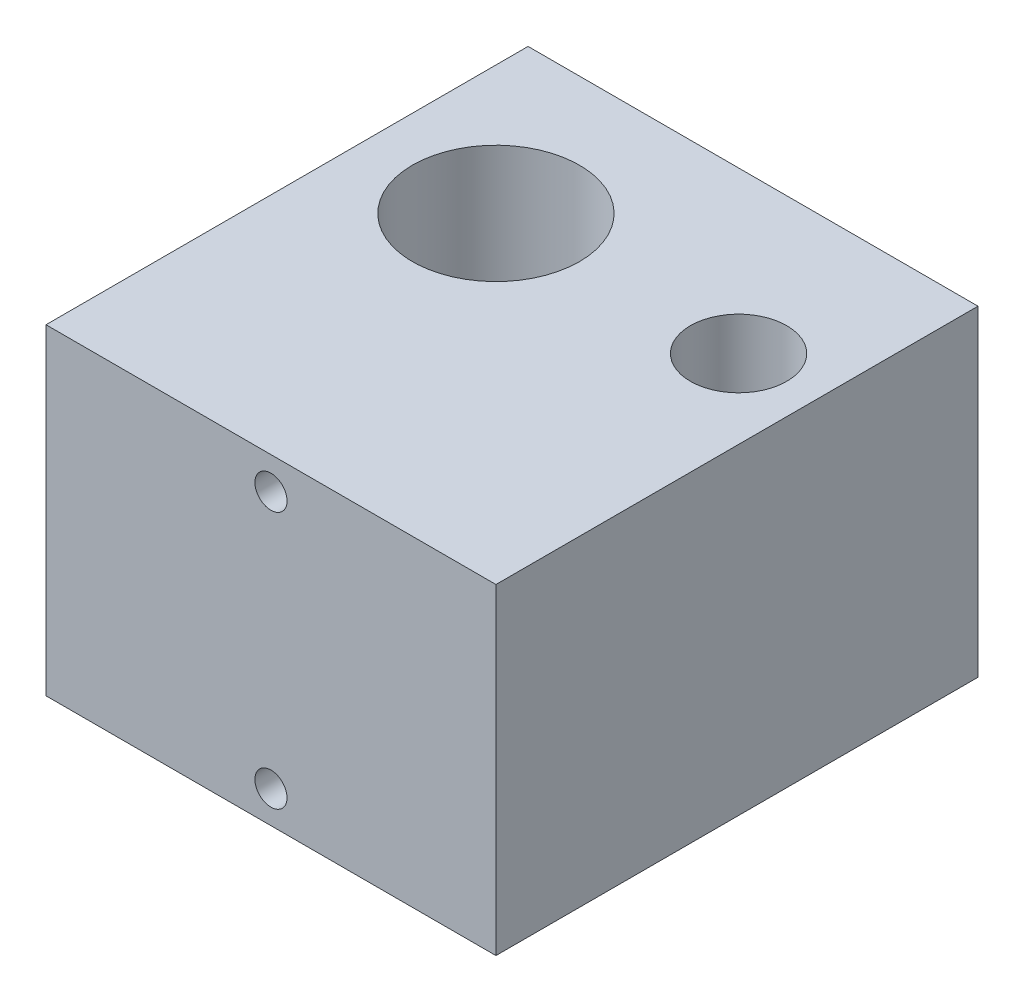
ISO-10303-21;
HEADER;
FILE_DESCRIPTION(('STEP AP214'),'2;1');
FILE_NAME('part.step','',(''),(''),'','','');
FILE_SCHEMA(('AUTOMOTIVE_DESIGN { 1 0 10303 214 1 1 1 1 }'));
ENDSEC;
DATA;
#1=APPLICATION_CONTEXT('core data for automotive mechanical design processes');
#2=APPLICATION_PROTOCOL_DEFINITION('international standard','automotive_design',2000,#1);
#3=PRODUCT_CONTEXT('',#1,'mechanical');
#4=PRODUCT('Part','Part','',(#3));
#5=PRODUCT_RELATED_PRODUCT_CATEGORY('part','',(#4));
#6=PRODUCT_DEFINITION_FORMATION('','',#4);
#7=PRODUCT_DEFINITION_CONTEXT('part definition',#1,'design');
#8=PRODUCT_DEFINITION('design','',#6,#7);
#9=PRODUCT_DEFINITION_SHAPE('','',#8);
#10=(LENGTH_UNIT() NAMED_UNIT(*) SI_UNIT(.MILLI.,.METRE.));
#11=(NAMED_UNIT(*) PLANE_ANGLE_UNIT() SI_UNIT($,.RADIAN.));
#12=(NAMED_UNIT(*) SI_UNIT($,.STERADIAN.) SOLID_ANGLE_UNIT());
#13=UNCERTAINTY_MEASURE_WITH_UNIT(LENGTH_MEASURE(1.E-05),#10,'distance_accuracy_value','');
#14=(GEOMETRIC_REPRESENTATION_CONTEXT(3) GLOBAL_UNCERTAINTY_ASSIGNED_CONTEXT((#13)) GLOBAL_UNIT_ASSIGNED_CONTEXT((#10,
#11,#12)) REPRESENTATION_CONTEXT('',''));
#15=CARTESIAN_POINT('',(0.,0.,0.));
#16=DIRECTION('',(0.,0.,1.));
#17=DIRECTION('',(1.,0.,0.));
#18=AXIS2_PLACEMENT_3D('',#15,#16,#17);
#19=CARTESIAN_POINT('',(-35.,-25.,75.));
#20=DIRECTION('',(1.,0.,0.));
#21=DIRECTION('',(0.,0.,-1.));
#22=AXIS2_PLACEMENT_3D('',#19,#20,#21);
#23=PLANE('',#22);
#24=DIRECTION('',(0.,-1.,0.));
#25=VECTOR('',#24,1.);
#26=CARTESIAN_POINT('',(-35.,-25.,0.));
#27=LINE('',#26,#25);
#28=CARTESIAN_POINT('',(-35.,25.,0.));
#29=VERTEX_POINT('',#28);
#30=CARTESIAN_POINT('',(-35.,-25.,0.));
#31=VERTEX_POINT('',#30);
#32=EDGE_CURVE('E107',#29,#31,#27,.T.);
#33=ORIENTED_EDGE('',*,*,#32,.T.);
#34=DIRECTION('',(0.,0.,-1.));
#35=VECTOR('',#34,1.);
#36=CARTESIAN_POINT('',(-35.,-25.,75.));
#37=LINE('',#36,#35);
#38=CARTESIAN_POINT('',(-35.,-25.,75.));
#39=VERTEX_POINT('',#38);
#40=EDGE_CURVE('E11',#39,#31,#37,.T.);
#41=ORIENTED_EDGE('',*,*,#40,.F.);
#42=DIRECTION('',(0.,-1.,0.));
#43=VECTOR('',#42,1.);
#44=CARTESIAN_POINT('',(-35.,-25.,75.));
#45=LINE('',#44,#43);
#46=CARTESIAN_POINT('',(-35.,25.,75.));
#47=VERTEX_POINT('',#46);
#48=EDGE_CURVE('E91',#47,#39,#45,.T.);
#49=ORIENTED_EDGE('',*,*,#48,.F.);
#50=DIRECTION('',(0.,0.,-1.));
#51=VECTOR('',#50,1.);
#52=CARTESIAN_POINT('',(-35.,25.,75.));
#53=LINE('',#52,#51);
#54=EDGE_CURVE('E103',#47,#29,#53,.T.);
#55=ORIENTED_EDGE('',*,*,#54,.T.);
#56=EDGE_LOOP('',(#33,#41,#49,#55));
#57=FACE_BOUND('',#56,.T.);
#58=ADVANCED_FACE('F39',(#57),#23,.F.);
#59=CARTESIAN_POINT('',(35.,-25.,75.));
#60=DIRECTION('',(0.,1.,0.));
#61=DIRECTION('',(-1.,0.,0.));
#62=AXIS2_PLACEMENT_3D('',#59,#60,#61);
#63=PLANE('',#62);
#64=CARTESIAN_POINT('',(22.75,-25.,25.));
#65=DIRECTION('',(0.,1.,0.));
#66=DIRECTION('',(-1.,0.,0.));
#67=AXIS2_PLACEMENT_3D('',#64,#65,#66);
#68=CIRCLE('',#67,7.5);
#69=CARTESIAN_POINT('',(15.25,-25.,25.));
#70=VERTEX_POINT('',#69);
#71=EDGE_CURVE('E111',#70,#70,#68,.F.);
#72=ORIENTED_EDGE('',*,*,#71,.F.);
#73=EDGE_LOOP('',(#72));
#74=FACE_BOUND('',#73,.T.);
#75=CARTESIAN_POINT('',(-15.,-25.,25.));
#76=DIRECTION('',(0.,1.,0.));
#77=DIRECTION('',(-1.,0.,0.));
#78=AXIS2_PLACEMENT_3D('',#75,#76,#77);
#79=CIRCLE('',#78,13.);
#80=CARTESIAN_POINT('',(-28.,-25.,25.));
#81=VERTEX_POINT('',#80);
#82=EDGE_CURVE('E128',#81,#81,#79,.F.);
#83=ORIENTED_EDGE('',*,*,#82,.F.);
#84=EDGE_LOOP('',(#83));
#85=FACE_BOUND('',#84,.T.);
#86=DIRECTION('',(1.,0.,0.));
#87=VECTOR('',#86,1.);
#88=CARTESIAN_POINT('',(35.,-25.,0.));
#89=LINE('',#88,#87);
#90=CARTESIAN_POINT('',(35.,-25.,0.));
#91=VERTEX_POINT('',#90);
#92=EDGE_CURVE('E96',#31,#91,#89,.T.);
#93=ORIENTED_EDGE('',*,*,#92,.T.);
#94=DIRECTION('',(0.,0.,-1.));
#95=VECTOR('',#94,1.);
#96=CARTESIAN_POINT('',(35.,-25.,75.));
#97=LINE('',#96,#95);
#98=CARTESIAN_POINT('',(35.,-25.,75.));
#99=VERTEX_POINT('',#98);
#100=EDGE_CURVE('E48',#99,#91,#97,.T.);
#101=ORIENTED_EDGE('',*,*,#100,.F.);
#102=DIRECTION('',(1.,0.,0.));
#103=VECTOR('',#102,1.);
#104=CARTESIAN_POINT('',(35.,-25.,75.));
#105=LINE('',#104,#103);
#106=EDGE_CURVE('E86',#39,#99,#105,.T.);
#107=ORIENTED_EDGE('',*,*,#106,.F.);
#108=ORIENTED_EDGE('',*,*,#40,.T.);
#109=EDGE_LOOP('',(#93,#101,#107,#108));
#110=FACE_BOUND('',#109,.T.);
#111=ADVANCED_FACE('F95',(#74,#85,#110),#63,.F.);
#112=CARTESIAN_POINT('',(35.,-25.,75.));
#113=DIRECTION('',(-1.,0.,0.));
#114=DIRECTION('',(0.,0.,1.));
#115=AXIS2_PLACEMENT_3D('',#112,#113,#114);
#116=PLANE('',#115);
#117=DIRECTION('',(0.,1.,0.));
#118=VECTOR('',#117,1.);
#119=CARTESIAN_POINT('',(35.,-25.,0.));
#120=LINE('',#119,#118);
#121=CARTESIAN_POINT('',(35.,25.,0.));
#122=VERTEX_POINT('',#121);
#123=EDGE_CURVE('E73',#91,#122,#120,.T.);
#124=ORIENTED_EDGE('',*,*,#123,.T.);
#125=DIRECTION('',(0.,0.,-1.));
#126=VECTOR('',#125,1.);
#127=CARTESIAN_POINT('',(35.,25.,75.));
#128=LINE('',#127,#126);
#129=CARTESIAN_POINT('',(35.,25.,75.));
#130=VERTEX_POINT('',#129);
#131=EDGE_CURVE('E98',#130,#122,#128,.T.);
#132=ORIENTED_EDGE('',*,*,#131,.F.);
#133=DIRECTION('',(0.,1.,0.));
#134=VECTOR('',#133,1.);
#135=CARTESIAN_POINT('',(35.,-25.,75.));
#136=LINE('',#135,#134);
#137=EDGE_CURVE('E89',#99,#130,#136,.T.);
#138=ORIENTED_EDGE('',*,*,#137,.F.);
#139=ORIENTED_EDGE('',*,*,#100,.T.);
#140=EDGE_LOOP('',(#124,#132,#138,#139));
#141=FACE_BOUND('',#140,.T.);
#142=ADVANCED_FACE('F99',(#141),#116,.F.);
#143=CARTESIAN_POINT('',(35.,25.,75.));
#144=DIRECTION('',(0.,-1.,0.));
#145=DIRECTION('',(1.,0.,0.));
#146=AXIS2_PLACEMENT_3D('',#143,#144,#145);
#147=PLANE('',#146);
#148=CARTESIAN_POINT('',(22.75,25.,25.));
#149=DIRECTION('',(0.,1.,0.));
#150=DIRECTION('',(-1.,0.,0.));
#151=AXIS2_PLACEMENT_3D('',#148,#149,#150);
#152=CIRCLE('',#151,7.5);
#153=CARTESIAN_POINT('',(15.25,25.,25.));
#154=VERTEX_POINT('',#153);
#155=EDGE_CURVE('E132',#154,#154,#152,.T.);
#156=ORIENTED_EDGE('',*,*,#155,.F.);
#157=EDGE_LOOP('',(#156));
#158=FACE_BOUND('',#157,.T.);
#159=CARTESIAN_POINT('',(-15.,25.,25.));
#160=DIRECTION('',(0.,1.,0.));
#161=DIRECTION('',(-1.,0.,0.));
#162=AXIS2_PLACEMENT_3D('',#159,#160,#161);
#163=CIRCLE('',#162,13.);
#164=CARTESIAN_POINT('',(-28.,25.,25.));
#165=VERTEX_POINT('',#164);
#166=EDGE_CURVE('E133',#165,#165,#163,.T.);
#167=ORIENTED_EDGE('',*,*,#166,.F.);
#168=EDGE_LOOP('',(#167));
#169=FACE_BOUND('',#168,.T.);
#170=DIRECTION('',(-1.,0.,0.));
#171=VECTOR('',#170,1.);
#172=CARTESIAN_POINT('',(35.,25.,0.));
#173=LINE('',#172,#171);
#174=EDGE_CURVE('E79',#122,#29,#173,.T.);
#175=ORIENTED_EDGE('',*,*,#174,.T.);
#176=ORIENTED_EDGE('',*,*,#54,.F.);
#177=DIRECTION('',(-1.,0.,0.));
#178=VECTOR('',#177,1.);
#179=CARTESIAN_POINT('',(35.,25.,75.));
#180=LINE('',#179,#178);
#181=EDGE_CURVE('E56',#130,#47,#180,.T.);
#182=ORIENTED_EDGE('',*,*,#181,.F.);
#183=ORIENTED_EDGE('',*,*,#131,.T.);
#184=EDGE_LOOP('',(#175,#176,#182,#183));
#185=FACE_BOUND('',#184,.T.);
#186=ADVANCED_FACE('F121',(#158,#169,#185),#147,.F.);
#187=CARTESIAN_POINT('',(0.,0.,75.));
#188=DIRECTION('',(0.,0.,1.));
#189=DIRECTION('',(1.,0.,0.));
#190=AXIS2_PLACEMENT_3D('',#187,#188,#189);
#191=PLANE('',#190);
#192=CARTESIAN_POINT('',(0.,-20.,75.));
#193=DIRECTION('',(0.,0.,1.));
#194=DIRECTION('',(1.,0.,0.));
#195=AXIS2_PLACEMENT_3D('',#192,#193,#194);
#196=CIRCLE('',#195,2.5);
#197=CARTESIAN_POINT('',(2.50000000000001,-20.,75.));
#198=VERTEX_POINT('',#197);
#199=EDGE_CURVE('E152',#198,#198,#196,.T.);
#200=ORIENTED_EDGE('',*,*,#199,.F.);
#201=EDGE_LOOP('',(#200));
#202=FACE_BOUND('',#201,.T.);
#203=CARTESIAN_POINT('',(0.,20.,75.));
#204=DIRECTION('',(0.,0.,1.));
#205=DIRECTION('',(-1.,0.,0.));
#206=AXIS2_PLACEMENT_3D('',#203,#204,#205);
#207=CIRCLE('',#206,2.5);
#208=CARTESIAN_POINT('',(-2.49999999999999,20.,75.));
#209=VERTEX_POINT('',#208);
#210=EDGE_CURVE('E144',#209,#209,#207,.T.);
#211=ORIENTED_EDGE('',*,*,#210,.F.);
#212=EDGE_LOOP('',(#211));
#213=FACE_BOUND('',#212,.T.);
#214=ORIENTED_EDGE('',*,*,#48,.T.);
#215=ORIENTED_EDGE('',*,*,#106,.T.);
#216=ORIENTED_EDGE('',*,*,#137,.T.);
#217=ORIENTED_EDGE('',*,*,#181,.T.);
#218=EDGE_LOOP('',(#214,#215,#216,#217));
#219=FACE_BOUND('',#218,.T.);
#220=ADVANCED_FACE('F87',(#202,#213,#219),#191,.T.);
#221=CARTESIAN_POINT('',(0.,0.,0.));
#222=DIRECTION('',(0.,0.,1.));
#223=DIRECTION('',(1.,0.,0.));
#224=AXIS2_PLACEMENT_3D('',#221,#222,#223);
#225=PLANE('',#224);
#226=ORIENTED_EDGE('',*,*,#32,.F.);
#227=ORIENTED_EDGE('',*,*,#174,.F.);
#228=ORIENTED_EDGE('',*,*,#123,.F.);
#229=ORIENTED_EDGE('',*,*,#92,.F.);
#230=EDGE_LOOP('',(#226,#227,#228,#229));
#231=FACE_BOUND('',#230,.T.);
#232=ADVANCED_FACE('F124',(#231),#225,.F.);
#233=CARTESIAN_POINT('',(-15.,-25.001,25.));
#234=DIRECTION('',(0.,1.,0.));
#235=DIRECTION('',(-1.,0.,0.));
#236=AXIS2_PLACEMENT_3D('',#233,#234,#235);
#237=CYLINDRICAL_SURFACE('',#236,13.);
#238=ORIENTED_EDGE('',*,*,#166,.T.);
#239=EDGE_LOOP('',(#238));
#240=FACE_BOUND('',#239,.T.);
#241=ORIENTED_EDGE('',*,*,#82,.T.);
#242=EDGE_LOOP('',(#241));
#243=FACE_BOUND('',#242,.T.);
#244=ADVANCED_FACE('F185',(#240,#243),#237,.F.);
#245=CARTESIAN_POINT('',(22.75,-25.001,25.));
#246=DIRECTION('',(0.,1.,0.));
#247=DIRECTION('',(-1.,0.,0.));
#248=AXIS2_PLACEMENT_3D('',#245,#246,#247);
#249=CYLINDRICAL_SURFACE('',#248,7.5);
#250=ORIENTED_EDGE('',*,*,#155,.T.);
#251=EDGE_LOOP('',(#250));
#252=FACE_BOUND('',#251,.T.);
#253=ORIENTED_EDGE('',*,*,#71,.T.);
#254=EDGE_LOOP('',(#253));
#255=FACE_BOUND('',#254,.T.);
#256=ADVANCED_FACE('F176',(#252,#255),#249,.F.);
#257=CARTESIAN_POINT('',(0.,20.,55.));
#258=DIRECTION('',(0.,0.,1.));
#259=DIRECTION('',(1.,0.,0.));
#260=AXIS2_PLACEMENT_3D('',#257,#258,#259);
#261=CYLINDRICAL_SURFACE('',#260,2.5);
#262=CARTESIAN_POINT('',(0.,20.,55.));
#263=DIRECTION('',(0.,0.,1.));
#264=DIRECTION('',(-1.,0.,0.));
#265=AXIS2_PLACEMENT_3D('',#262,#263,#264);
#266=CIRCLE('',#265,2.5);
#267=CARTESIAN_POINT('',(-2.49999999999999,20.,55.));
#268=VERTEX_POINT('',#267);
#269=EDGE_CURVE('E148',#268,#268,#266,.T.);
#270=ORIENTED_EDGE('',*,*,#269,.F.);
#271=EDGE_LOOP('',(#270));
#272=FACE_BOUND('',#271,.T.);
#273=ORIENTED_EDGE('',*,*,#210,.T.);
#274=EDGE_LOOP('',(#273));
#275=FACE_BOUND('',#274,.T.);
#276=ADVANCED_FACE('F174',(#272,#275),#261,.F.);
#277=CARTESIAN_POINT('',(0.,20.,55.));
#278=DIRECTION('',(0.,0.,-1.));
#279=DIRECTION('',(-1.,0.,0.));
#280=AXIS2_PLACEMENT_3D('',#277,#278,#279);
#281=PLANE('',#280);
#282=ORIENTED_EDGE('',*,*,#269,.T.);
#283=EDGE_LOOP('',(#282));
#284=FACE_BOUND('',#283,.T.);
#285=ADVANCED_FACE('F165',(#284),#281,.F.);
#286=CARTESIAN_POINT('',(0.,-20.,55.));
#287=DIRECTION('',(0.,0.,1.));
#288=DIRECTION('',(1.,0.,0.));
#289=AXIS2_PLACEMENT_3D('',#286,#287,#288);
#290=CYLINDRICAL_SURFACE('',#289,2.5);
#291=CARTESIAN_POINT('',(0.,-20.,55.));
#292=DIRECTION('',(0.,0.,1.));
#293=DIRECTION('',(1.,0.,0.));
#294=AXIS2_PLACEMENT_3D('',#291,#292,#293);
#295=CIRCLE('',#294,2.5);
#296=CARTESIAN_POINT('',(2.50000000000001,-20.,55.));
#297=VERTEX_POINT('',#296);
#298=EDGE_CURVE('E137',#297,#297,#295,.T.);
#299=ORIENTED_EDGE('',*,*,#298,.F.);
#300=EDGE_LOOP('',(#299));
#301=FACE_BOUND('',#300,.T.);
#302=ORIENTED_EDGE('',*,*,#199,.T.);
#303=EDGE_LOOP('',(#302));
#304=FACE_BOUND('',#303,.T.);
#305=ADVANCED_FACE('F162',(#301,#304),#290,.F.);
#306=CARTESIAN_POINT('',(0.,-20.,55.));
#307=DIRECTION('',(0.,0.,1.));
#308=DIRECTION('',(1.,0.,0.));
#309=AXIS2_PLACEMENT_3D('',#306,#307,#308);
#310=PLANE('',#309);
#311=ORIENTED_EDGE('',*,*,#298,.T.);
#312=EDGE_LOOP('',(#311));
#313=FACE_BOUND('',#312,.T.);
#314=ADVANCED_FACE('F160',(#313),#310,.T.);
#315=CLOSED_SHELL('',(#58,#111,#142,#186,#220,#232,#244,#256,#276,#285,#305,#314));
#316=MANIFOLD_SOLID_BREP('B2',#315);
#317=ADVANCED_BREP_SHAPE_REPRESENTATION('',(#18,#316),#14);
#318=SHAPE_DEFINITION_REPRESENTATION(#9,#317);
ENDSEC;
END-ISO-10303-21;
